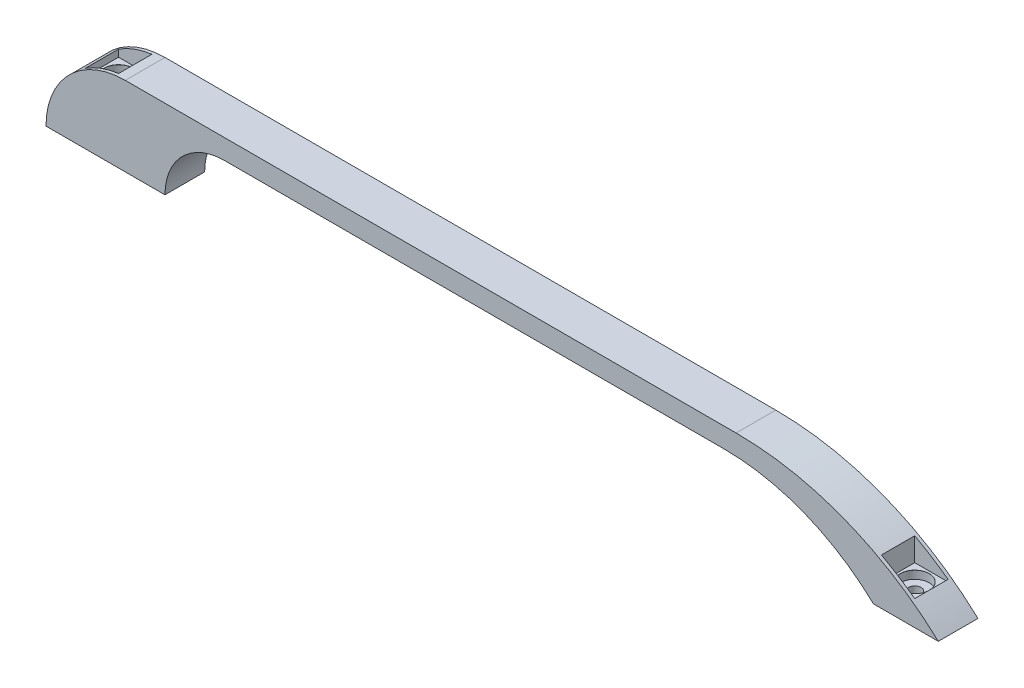
ISO-10303-21;
HEADER;
FILE_DESCRIPTION(('STEP AP214'),'2;1');
FILE_NAME('part.step','',(''),(''),'','','');
FILE_SCHEMA(('AUTOMOTIVE_DESIGN { 1 0 10303 214 1 1 1 1 }'));
ENDSEC;
DATA;
#1=APPLICATION_CONTEXT('core data for automotive mechanical design processes');
#2=APPLICATION_PROTOCOL_DEFINITION('international standard','automotive_design',2000,#1);
#3=PRODUCT_CONTEXT('',#1,'mechanical');
#4=PRODUCT('Part','Part','',(#3));
#5=PRODUCT_RELATED_PRODUCT_CATEGORY('part','',(#4));
#6=PRODUCT_DEFINITION_FORMATION('','',#4);
#7=PRODUCT_DEFINITION_CONTEXT('part definition',#1,'design');
#8=PRODUCT_DEFINITION('design','',#6,#7);
#9=PRODUCT_DEFINITION_SHAPE('','',#8);
#10=(LENGTH_UNIT() NAMED_UNIT(*) SI_UNIT(.MILLI.,.METRE.));
#11=(NAMED_UNIT(*) PLANE_ANGLE_UNIT() SI_UNIT($,.RADIAN.));
#12=(NAMED_UNIT(*) SI_UNIT($,.STERADIAN.) SOLID_ANGLE_UNIT());
#13=UNCERTAINTY_MEASURE_WITH_UNIT(LENGTH_MEASURE(1.E-05),#10,'distance_accuracy_value','');
#14=(GEOMETRIC_REPRESENTATION_CONTEXT(3) GLOBAL_UNCERTAINTY_ASSIGNED_CONTEXT((#13)) GLOBAL_UNIT_ASSIGNED_CONTEXT((#10,
#11,#12)) REPRESENTATION_CONTEXT('',''));
#15=CARTESIAN_POINT('',(0.,0.,0.));
#16=DIRECTION('',(0.,0.,1.));
#17=DIRECTION('',(1.,0.,0.));
#18=AXIS2_PLACEMENT_3D('',#15,#16,#17);
#19=CARTESIAN_POINT('',(348.019609728144,-110.,20.));
#20=DIRECTION('',(0.,0.,-1.));
#21=DIRECTION('',(-1.,0.,0.));
#22=AXIS2_PLACEMENT_3D('',#19,#20,#21);
#23=CYLINDRICAL_SURFACE('',#22,150.);
#24=CARTESIAN_POINT('',(348.019609728144,-110.,0.));
#25=DIRECTION('',(0.,0.,1.));
#26=DIRECTION('',(-1.,0.,0.));
#27=AXIS2_PLACEMENT_3D('',#24,#25,#26);
#28=CIRCLE('',#27,150.);
#29=CARTESIAN_POINT('',(450.,0.,0.));
#30=VERTEX_POINT('',#29);
#31=CARTESIAN_POINT('',(348.019609728144,40.,0.));
#32=VERTEX_POINT('',#31);
#33=EDGE_CURVE('E242',#30,#32,#28,.T.);
#34=ORIENTED_EDGE('',*,*,#33,.T.);
#35=DIRECTION('',(0.,0.,-1.));
#36=VECTOR('',#35,1.);
#37=CARTESIAN_POINT('',(348.019609728144,40.,20.));
#38=LINE('',#37,#36);
#39=CARTESIAN_POINT('',(348.019609728144,40.,20.));
#40=VERTEX_POINT('',#39);
#41=EDGE_CURVE('E247',#40,#32,#38,.T.);
#42=ORIENTED_EDGE('',*,*,#41,.F.);
#43=CARTESIAN_POINT('',(348.019609728144,-110.,20.));
#44=DIRECTION('',(0.,0.,1.));
#45=DIRECTION('',(-1.,0.,0.));
#46=AXIS2_PLACEMENT_3D('',#43,#44,#45);
#47=CIRCLE('',#46,150.);
#48=CARTESIAN_POINT('',(450.,0.,20.));
#49=VERTEX_POINT('',#48);
#50=EDGE_CURVE('E224',#49,#40,#47,.T.);
#51=ORIENTED_EDGE('',*,*,#50,.F.);
#52=DIRECTION('',(0.,0.,-1.));
#53=VECTOR('',#52,1.);
#54=CARTESIAN_POINT('',(450.,0.,20.));
#55=LINE('',#54,#53);
#56=EDGE_CURVE('E250',#49,#30,#55,.T.);
#57=ORIENTED_EDGE('',*,*,#56,.T.);
#58=EDGE_LOOP('',(#34,#42,#51,#57));
#59=FACE_BOUND('',#58,.T.);
#60=DIRECTION('',(0.,0.,-1.));
#61=VECTOR('',#60,1.);
#62=CARTESIAN_POINT('',(419.7,21.7646449184092,20.));
#63=LINE('',#62,#61);
#64=CARTESIAN_POINT('',(419.7,21.7646449184092,1.6));
#65=VERTEX_POINT('',#64);
#66=CARTESIAN_POINT('',(419.7,21.7646449184092,18.4));
#67=VERTEX_POINT('',#66);
#68=EDGE_CURVE('E11',#65,#67,#63,.F.);
#69=ORIENTED_EDGE('',*,*,#68,.F.);
#70=CARTESIAN_POINT('',(348.019609728144,-110.,1.60000000000001));
#71=DIRECTION('',(0.,0.,1.));
#72=DIRECTION('',(1.,0.,0.));
#73=AXIS2_PLACEMENT_3D('',#70,#71,#72);
#74=CIRCLE('',#73,150.);
#75=CARTESIAN_POINT('',(436.5,11.1248138794859,1.6));
#76=VERTEX_POINT('',#75);
#77=EDGE_CURVE('E276',#76,#65,#74,.T.);
#78=ORIENTED_EDGE('',*,*,#77,.F.);
#79=DIRECTION('',(0.,0.,-1.));
#80=VECTOR('',#79,1.);
#81=CARTESIAN_POINT('',(436.5,11.1248138794859,20.));
#82=LINE('',#81,#80);
#83=CARTESIAN_POINT('',(436.5,11.1248138794859,18.4));
#84=VERTEX_POINT('',#83);
#85=EDGE_CURVE('E278',#84,#76,#82,.T.);
#86=ORIENTED_EDGE('',*,*,#85,.F.);
#87=CARTESIAN_POINT('',(348.019609728144,-110.,18.4));
#88=DIRECTION('',(0.,0.,-1.));
#89=DIRECTION('',(-1.,0.,0.));
#90=AXIS2_PLACEMENT_3D('',#87,#88,#89);
#91=CIRCLE('',#90,150.);
#92=EDGE_CURVE('E49',#67,#84,#91,.T.);
#93=ORIENTED_EDGE('',*,*,#92,.F.);
#94=EDGE_LOOP('',(#69,#78,#86,#93));
#95=FACE_BOUND('',#94,.T.);
#96=ADVANCED_FACE('F40',(#59,#95),#23,.T.);
#97=CARTESIAN_POINT('',(40.,0.,20.));
#98=DIRECTION('',(0.,0.,-1.));
#99=DIRECTION('',(-1.,0.,0.));
#100=AXIS2_PLACEMENT_3D('',#97,#98,#99);
#101=CYLINDRICAL_SURFACE('',#100,40.);
#102=CARTESIAN_POINT('',(40.,0.,0.));
#103=DIRECTION('',(0.,0.,1.));
#104=DIRECTION('',(1.,0.,0.));
#105=AXIS2_PLACEMENT_3D('',#102,#103,#104);
#106=CIRCLE('',#105,40.);
#107=CARTESIAN_POINT('',(40.,40.,0.));
#108=VERTEX_POINT('',#107);
#109=CARTESIAN_POINT('',(0.,0.,0.));
#110=VERTEX_POINT('',#109);
#111=EDGE_CURVE('E209',#108,#110,#106,.T.);
#112=ORIENTED_EDGE('',*,*,#111,.T.);
#113=DIRECTION('',(0.,0.,-1.));
#114=VECTOR('',#113,1.);
#115=CARTESIAN_POINT('',(0.,0.,20.));
#116=LINE('',#115,#114);
#117=CARTESIAN_POINT('',(0.,0.,20.));
#118=VERTEX_POINT('',#117);
#119=EDGE_CURVE('E265',#118,#110,#116,.T.);
#120=ORIENTED_EDGE('',*,*,#119,.F.);
#121=CARTESIAN_POINT('',(40.,0.,20.));
#122=DIRECTION('',(0.,0.,1.));
#123=DIRECTION('',(1.,0.,0.));
#124=AXIS2_PLACEMENT_3D('',#121,#122,#123);
#125=CIRCLE('',#124,40.);
#126=CARTESIAN_POINT('',(40.,40.,20.));
#127=VERTEX_POINT('',#126);
#128=EDGE_CURVE('E210',#127,#118,#125,.T.);
#129=ORIENTED_EDGE('',*,*,#128,.F.);
#130=DIRECTION('',(0.,0.,-1.));
#131=VECTOR('',#130,1.);
#132=CARTESIAN_POINT('',(40.,40.,20.));
#133=LINE('',#132,#131);
#134=EDGE_CURVE('E228',#127,#108,#133,.T.);
#135=ORIENTED_EDGE('',*,*,#134,.T.);
#136=EDGE_LOOP('',(#112,#120,#129,#135));
#137=FACE_BOUND('',#136,.T.);
#138=CARTESIAN_POINT('',(40.,0.,1.6));
#139=DIRECTION('',(0.,0.,1.));
#140=DIRECTION('',(1.,0.,0.));
#141=AXIS2_PLACEMENT_3D('',#138,#139,#140);
#142=CIRCLE('',#141,40.);
#143=CARTESIAN_POINT('',(35.,39.6862696659689,1.6));
#144=VERTEX_POINT('',#143);
#145=CARTESIAN_POINT('',(18.2,33.5374417629014,1.6));
#146=VERTEX_POINT('',#145);
#147=EDGE_CURVE('E274',#144,#146,#142,.T.);
#148=ORIENTED_EDGE('',*,*,#147,.F.);
#149=DIRECTION('',(0.,0.,-1.));
#150=VECTOR('',#149,1.);
#151=CARTESIAN_POINT('',(35.,39.6862696659689,20.));
#152=LINE('',#151,#150);
#153=CARTESIAN_POINT('',(35.,39.6862696659689,18.4));
#154=VERTEX_POINT('',#153);
#155=EDGE_CURVE('E268',#154,#144,#152,.T.);
#156=ORIENTED_EDGE('',*,*,#155,.F.);
#157=CARTESIAN_POINT('',(40.,0.,18.4));
#158=DIRECTION('',(0.,0.,-1.));
#159=DIRECTION('',(-1.,0.,0.));
#160=AXIS2_PLACEMENT_3D('',#157,#158,#159);
#161=CIRCLE('',#160,40.);
#162=CARTESIAN_POINT('',(18.2,33.5374417629014,18.4));
#163=VERTEX_POINT('',#162);
#164=EDGE_CURVE('E270',#163,#154,#161,.T.);
#165=ORIENTED_EDGE('',*,*,#164,.F.);
#166=DIRECTION('',(0.,0.,-1.));
#167=VECTOR('',#166,1.);
#168=CARTESIAN_POINT('',(18.2,33.5374417629014,20.));
#169=LINE('',#168,#167);
#170=EDGE_CURVE('E272',#146,#163,#169,.F.);
#171=ORIENTED_EDGE('',*,*,#170,.F.);
#172=EDGE_LOOP('',(#148,#156,#165,#171));
#173=FACE_BOUND('',#172,.T.);
#174=ADVANCED_FACE('F42',(#137,#173),#101,.T.);
#175=CARTESIAN_POINT('',(0.,0.,20.));
#176=DIRECTION('',(0.,1.,0.));
#177=DIRECTION('',(0.,0.,1.));
#178=AXIS2_PLACEMENT_3D('',#175,#176,#177);
#179=PLANE('',#178);
#180=CARTESIAN_POINT('',(26.6,0.,10.));
#181=DIRECTION('',(0.,1.,0.));
#182=DIRECTION('',(0.,0.,1.));
#183=AXIS2_PLACEMENT_3D('',#180,#181,#182);
#184=CIRCLE('',#183,3.19999999999999);
#185=CARTESIAN_POINT('',(26.6,0.,13.2));
#186=VERTEX_POINT('',#185);
#187=EDGE_CURVE('E44',#186,#186,#184,.T.);
#188=ORIENTED_EDGE('',*,*,#187,.T.);
#189=EDGE_LOOP('',(#188));
#190=FACE_BOUND('',#189,.T.);
#191=DIRECTION('',(1.,0.,0.));
#192=VECTOR('',#191,1.);
#193=CARTESIAN_POINT('',(0.,0.,0.));
#194=LINE('',#193,#192);
#195=CARTESIAN_POINT('',(60.,0.,0.));
#196=VERTEX_POINT('',#195);
#197=EDGE_CURVE('E231',#110,#196,#194,.T.);
#198=ORIENTED_EDGE('',*,*,#197,.T.);
#199=DIRECTION('',(0.,0.,-1.));
#200=VECTOR('',#199,1.);
#201=CARTESIAN_POINT('',(60.,0.,20.));
#202=LINE('',#201,#200);
#203=CARTESIAN_POINT('',(60.,0.,20.));
#204=VERTEX_POINT('',#203);
#205=EDGE_CURVE('E262',#204,#196,#202,.T.);
#206=ORIENTED_EDGE('',*,*,#205,.F.);
#207=DIRECTION('',(1.,0.,0.));
#208=VECTOR('',#207,1.);
#209=CARTESIAN_POINT('',(0.,0.,20.));
#210=LINE('',#209,#208);
#211=EDGE_CURVE('E213',#118,#204,#210,.T.);
#212=ORIENTED_EDGE('',*,*,#211,.F.);
#213=ORIENTED_EDGE('',*,*,#119,.T.);
#214=EDGE_LOOP('',(#198,#206,#212,#213));
#215=FACE_BOUND('',#214,.T.);
#216=ADVANCED_FACE('F302',(#190,#215),#179,.F.);
#217=CARTESIAN_POINT('',(90.,0.,20.));
#218=DIRECTION('',(0.,0.,-1.));
#219=DIRECTION('',(-1.,0.,0.));
#220=AXIS2_PLACEMENT_3D('',#217,#218,#219);
#221=CYLINDRICAL_SURFACE('',#220,30.);
#222=CARTESIAN_POINT('',(90.,0.,0.));
#223=DIRECTION('',(0.,0.,-1.));
#224=DIRECTION('',(-1.,0.,0.));
#225=AXIS2_PLACEMENT_3D('',#222,#223,#224);
#226=CIRCLE('',#225,30.);
#227=CARTESIAN_POINT('',(90.,30.,0.));
#228=VERTEX_POINT('',#227);
#229=EDGE_CURVE('E233',#196,#228,#226,.T.);
#230=ORIENTED_EDGE('',*,*,#229,.T.);
#231=DIRECTION('',(0.,0.,-1.));
#232=VECTOR('',#231,1.);
#233=CARTESIAN_POINT('',(90.,30.,20.));
#234=LINE('',#233,#232);
#235=CARTESIAN_POINT('',(90.,30.,20.));
#236=VERTEX_POINT('',#235);
#237=EDGE_CURVE('E259',#236,#228,#234,.T.);
#238=ORIENTED_EDGE('',*,*,#237,.F.);
#239=CARTESIAN_POINT('',(90.,0.,20.));
#240=DIRECTION('',(0.,0.,-1.));
#241=DIRECTION('',(-1.,0.,0.));
#242=AXIS2_PLACEMENT_3D('',#239,#240,#241);
#243=CIRCLE('',#242,30.);
#244=EDGE_CURVE('E216',#204,#236,#243,.T.);
#245=ORIENTED_EDGE('',*,*,#244,.F.);
#246=ORIENTED_EDGE('',*,*,#205,.T.);
#247=EDGE_LOOP('',(#230,#238,#245,#246));
#248=FACE_BOUND('',#247,.T.);
#249=ADVANCED_FACE('F319',(#248),#221,.F.);
#250=CARTESIAN_POINT('',(342.,30.,20.));
#251=DIRECTION('',(0.,1.,0.));
#252=DIRECTION('',(-1.,0.,0.));
#253=AXIS2_PLACEMENT_3D('',#250,#251,#252);
#254=PLANE('',#253);
#255=DIRECTION('',(1.,0.,0.));
#256=VECTOR('',#255,1.);
#257=CARTESIAN_POINT('',(342.,30.,0.));
#258=LINE('',#257,#256);
#259=CARTESIAN_POINT('',(342.,30.,0.));
#260=VERTEX_POINT('',#259);
#261=EDGE_CURVE('E236',#228,#260,#258,.T.);
#262=ORIENTED_EDGE('',*,*,#261,.T.);
#263=DIRECTION('',(0.,0.,-1.));
#264=VECTOR('',#263,1.);
#265=CARTESIAN_POINT('',(342.,30.,20.));
#266=LINE('',#265,#264);
#267=CARTESIAN_POINT('',(342.,30.,20.));
#268=VERTEX_POINT('',#267);
#269=EDGE_CURVE('E256',#268,#260,#266,.T.);
#270=ORIENTED_EDGE('',*,*,#269,.F.);
#271=DIRECTION('',(1.,0.,0.));
#272=VECTOR('',#271,1.);
#273=CARTESIAN_POINT('',(90.,30.,20.));
#274=LINE('',#273,#272);
#275=EDGE_CURVE('E218',#236,#268,#274,.T.);
#276=ORIENTED_EDGE('',*,*,#275,.F.);
#277=ORIENTED_EDGE('',*,*,#237,.T.);
#278=EDGE_LOOP('',(#262,#270,#276,#277));
#279=FACE_BOUND('',#278,.T.);
#280=ADVANCED_FACE('F315',(#279),#254,.F.);
#281=CARTESIAN_POINT('',(341.782107923545,-79.9997841954384,20.));
#282=DIRECTION('',(0.,0.,-1.));
#283=DIRECTION('',(-1.,0.,0.));
#284=AXIS2_PLACEMENT_3D('',#281,#282,#283);
#285=CYLINDRICAL_SURFACE('',#284,110.);
#286=CARTESIAN_POINT('',(341.782107923545,-79.9997841954384,0.));
#287=DIRECTION('',(0.,0.,-1.));
#288=DIRECTION('',(-1.,0.,0.));
#289=AXIS2_PLACEMENT_3D('',#286,#287,#288);
#290=CIRCLE('',#289,110.);
#291=CARTESIAN_POINT('',(417.280680947698,0.,0.));
#292=VERTEX_POINT('',#291);
#293=EDGE_CURVE('E238',#260,#292,#290,.T.);
#294=ORIENTED_EDGE('',*,*,#293,.T.);
#295=DIRECTION('',(0.,0.,-1.));
#296=VECTOR('',#295,1.);
#297=CARTESIAN_POINT('',(417.280680947698,0.,20.));
#298=LINE('',#297,#296);
#299=CARTESIAN_POINT('',(417.280680947698,0.,20.));
#300=VERTEX_POINT('',#299);
#301=EDGE_CURVE('E253',#300,#292,#298,.T.);
#302=ORIENTED_EDGE('',*,*,#301,.F.);
#303=CARTESIAN_POINT('',(341.782107923545,-79.9997841954384,20.));
#304=DIRECTION('',(0.,0.,-1.));
#305=DIRECTION('',(-1.,0.,0.));
#306=AXIS2_PLACEMENT_3D('',#303,#304,#305);
#307=CIRCLE('',#306,110.);
#308=EDGE_CURVE('E220',#268,#300,#307,.T.);
#309=ORIENTED_EDGE('',*,*,#308,.F.);
#310=ORIENTED_EDGE('',*,*,#269,.T.);
#311=EDGE_LOOP('',(#294,#302,#309,#310));
#312=FACE_BOUND('',#311,.T.);
#313=ADVANCED_FACE('F311',(#312),#285,.F.);
#314=CARTESIAN_POINT('',(450.,0.,20.));
#315=DIRECTION('',(0.,1.,0.));
#316=DIRECTION('',(-1.,0.,0.));
#317=AXIS2_PLACEMENT_3D('',#314,#315,#316);
#318=PLANE('',#317);
#319=CARTESIAN_POINT('',(428.1,0.,10.));
#320=DIRECTION('',(0.,1.,0.));
#321=DIRECTION('',(-1.,0.,0.));
#322=AXIS2_PLACEMENT_3D('',#319,#320,#321);
#323=CIRCLE('',#322,3.19999999999998);
#324=CARTESIAN_POINT('',(424.9,0.,10.));
#325=VERTEX_POINT('',#324);
#326=EDGE_CURVE('E178',#325,#325,#323,.T.);
#327=ORIENTED_EDGE('',*,*,#326,.T.);
#328=EDGE_LOOP('',(#327));
#329=FACE_BOUND('',#328,.T.);
#330=DIRECTION('',(1.,0.,0.));
#331=VECTOR('',#330,1.);
#332=CARTESIAN_POINT('',(450.,0.,0.));
#333=LINE('',#332,#331);
#334=EDGE_CURVE('E240',#292,#30,#333,.T.);
#335=ORIENTED_EDGE('',*,*,#334,.T.);
#336=ORIENTED_EDGE('',*,*,#56,.F.);
#337=DIRECTION('',(1.,0.,0.));
#338=VECTOR('',#337,1.);
#339=CARTESIAN_POINT('',(450.,0.,20.));
#340=LINE('',#339,#338);
#341=EDGE_CURVE('E222',#300,#49,#340,.T.);
#342=ORIENTED_EDGE('',*,*,#341,.F.);
#343=ORIENTED_EDGE('',*,*,#301,.T.);
#344=EDGE_LOOP('',(#335,#336,#342,#343));
#345=FACE_BOUND('',#344,.T.);
#346=ADVANCED_FACE('F308',(#329,#345),#318,.F.);
#347=CARTESIAN_POINT('',(40.,40.,20.));
#348=DIRECTION('',(0.,-1.,0.));
#349=DIRECTION('',(1.,0.,0.));
#350=AXIS2_PLACEMENT_3D('',#347,#348,#349);
#351=PLANE('',#350);
#352=DIRECTION('',(-1.,0.,0.));
#353=VECTOR('',#352,1.);
#354=CARTESIAN_POINT('',(40.,40.,0.));
#355=LINE('',#354,#353);
#356=EDGE_CURVE('E214',#32,#108,#355,.T.);
#357=ORIENTED_EDGE('',*,*,#356,.T.);
#358=ORIENTED_EDGE('',*,*,#134,.F.);
#359=DIRECTION('',(-1.,0.,0.));
#360=VECTOR('',#359,1.);
#361=CARTESIAN_POINT('',(40.,40.,20.));
#362=LINE('',#361,#360);
#363=EDGE_CURVE('E226',#40,#127,#362,.T.);
#364=ORIENTED_EDGE('',*,*,#363,.F.);
#365=ORIENTED_EDGE('',*,*,#41,.T.);
#366=EDGE_LOOP('',(#357,#358,#364,#365));
#367=FACE_BOUND('',#366,.T.);
#368=ADVANCED_FACE('F306',(#367),#351,.F.);
#369=CARTESIAN_POINT('',(40.,0.,20.));
#370=DIRECTION('',(0.,0.,1.));
#371=DIRECTION('',(1.,0.,0.));
#372=AXIS2_PLACEMENT_3D('',#369,#370,#371);
#373=PLANE('',#372);
#374=ORIENTED_EDGE('',*,*,#128,.T.);
#375=ORIENTED_EDGE('',*,*,#211,.T.);
#376=ORIENTED_EDGE('',*,*,#244,.T.);
#377=ORIENTED_EDGE('',*,*,#275,.T.);
#378=ORIENTED_EDGE('',*,*,#308,.T.);
#379=ORIENTED_EDGE('',*,*,#341,.T.);
#380=ORIENTED_EDGE('',*,*,#50,.T.);
#381=ORIENTED_EDGE('',*,*,#363,.T.);
#382=EDGE_LOOP('',(#374,#375,#376,#377,#378,#379,#380,#381));
#383=FACE_BOUND('',#382,.T.);
#384=ADVANCED_FACE('F346',(#383),#373,.T.);
#385=CARTESIAN_POINT('',(40.,0.,0.));
#386=DIRECTION('',(0.,0.,1.));
#387=DIRECTION('',(1.,0.,0.));
#388=AXIS2_PLACEMENT_3D('',#385,#386,#387);
#389=PLANE('',#388);
#390=ORIENTED_EDGE('',*,*,#111,.F.);
#391=ORIENTED_EDGE('',*,*,#356,.F.);
#392=ORIENTED_EDGE('',*,*,#33,.F.);
#393=ORIENTED_EDGE('',*,*,#334,.F.);
#394=ORIENTED_EDGE('',*,*,#293,.F.);
#395=ORIENTED_EDGE('',*,*,#261,.F.);
#396=ORIENTED_EDGE('',*,*,#229,.F.);
#397=ORIENTED_EDGE('',*,*,#197,.F.);
#398=EDGE_LOOP('',(#390,#391,#392,#393,#394,#395,#396,#397));
#399=FACE_BOUND('',#398,.T.);
#400=ADVANCED_FACE('F337',(#399),#389,.F.);
#401=CARTESIAN_POINT('',(35.,50.,1.6));
#402=DIRECTION('',(0.,0.,1.));
#403=DIRECTION('',(1.,0.,0.));
#404=AXIS2_PLACEMENT_3D('',#401,#402,#403);
#405=PLANE('',#404);
#406=ORIENTED_EDGE('',*,*,#147,.T.);
#407=DIRECTION('',(0.,-1.,0.));
#408=VECTOR('',#407,1.);
#409=CARTESIAN_POINT('',(18.2,50.,1.6));
#410=LINE('',#409,#408);
#411=CARTESIAN_POINT('',(18.2,30.,1.6));
#412=VERTEX_POINT('',#411);
#413=EDGE_CURVE('E207',#146,#412,#410,.T.);
#414=ORIENTED_EDGE('',*,*,#413,.T.);
#415=DIRECTION('',(-1.,0.,0.));
#416=VECTOR('',#415,1.);
#417=CARTESIAN_POINT('',(35.,30.,1.6));
#418=LINE('',#417,#416);
#419=CARTESIAN_POINT('',(35.,30.,1.6));
#420=VERTEX_POINT('',#419);
#421=EDGE_CURVE('E163',#420,#412,#418,.T.);
#422=ORIENTED_EDGE('',*,*,#421,.F.);
#423=DIRECTION('',(0.,-1.,0.));
#424=VECTOR('',#423,1.);
#425=CARTESIAN_POINT('',(35.,50.,1.6));
#426=LINE('',#425,#424);
#427=EDGE_CURVE('E202',#144,#420,#426,.T.);
#428=ORIENTED_EDGE('',*,*,#427,.F.);
#429=EDGE_LOOP('',(#406,#414,#422,#428));
#430=FACE_BOUND('',#429,.T.);
#431=ADVANCED_FACE('F366',(#430),#405,.T.);
#432=CARTESIAN_POINT('',(18.2,50.,1.6));
#433=DIRECTION('',(1.,0.,0.));
#434=DIRECTION('',(0.,0.,-1.));
#435=AXIS2_PLACEMENT_3D('',#432,#433,#434);
#436=PLANE('',#435);
#437=ORIENTED_EDGE('',*,*,#170,.T.);
#438=DIRECTION('',(0.,-1.,0.));
#439=VECTOR('',#438,1.);
#440=CARTESIAN_POINT('',(18.2,50.,18.4));
#441=LINE('',#440,#439);
#442=CARTESIAN_POINT('',(18.2,30.,18.4));
#443=VERTEX_POINT('',#442);
#444=EDGE_CURVE('E205',#163,#443,#441,.T.);
#445=ORIENTED_EDGE('',*,*,#444,.T.);
#446=DIRECTION('',(0.,0.,1.));
#447=VECTOR('',#446,1.);
#448=CARTESIAN_POINT('',(18.2,30.,1.6));
#449=LINE('',#448,#447);
#450=EDGE_CURVE('E193',#412,#443,#449,.T.);
#451=ORIENTED_EDGE('',*,*,#450,.F.);
#452=ORIENTED_EDGE('',*,*,#413,.F.);
#453=EDGE_LOOP('',(#437,#445,#451,#452));
#454=FACE_BOUND('',#453,.T.);
#455=ADVANCED_FACE('F370',(#454),#436,.T.);
#456=CARTESIAN_POINT('',(18.2,50.,18.4));
#457=DIRECTION('',(0.,0.,-1.));
#458=DIRECTION('',(-1.,0.,0.));
#459=AXIS2_PLACEMENT_3D('',#456,#457,#458);
#460=PLANE('',#459);
#461=ORIENTED_EDGE('',*,*,#164,.T.);
#462=DIRECTION('',(0.,-1.,0.));
#463=VECTOR('',#462,1.);
#464=CARTESIAN_POINT('',(35.,50.,18.4));
#465=LINE('',#464,#463);
#466=CARTESIAN_POINT('',(35.,30.,18.4));
#467=VERTEX_POINT('',#466);
#468=EDGE_CURVE('E65',#154,#467,#465,.T.);
#469=ORIENTED_EDGE('',*,*,#468,.T.);
#470=DIRECTION('',(1.,0.,0.));
#471=VECTOR('',#470,1.);
#472=CARTESIAN_POINT('',(18.2,30.,18.4));
#473=LINE('',#472,#471);
#474=EDGE_CURVE('E196',#443,#467,#473,.T.);
#475=ORIENTED_EDGE('',*,*,#474,.F.);
#476=ORIENTED_EDGE('',*,*,#444,.F.);
#477=EDGE_LOOP('',(#461,#469,#475,#476));
#478=FACE_BOUND('',#477,.T.);
#479=ADVANCED_FACE('F374',(#478),#460,.T.);
#480=CARTESIAN_POINT('',(35.,50.,18.4));
#481=DIRECTION('',(-1.,0.,0.));
#482=DIRECTION('',(0.,0.,1.));
#483=AXIS2_PLACEMENT_3D('',#480,#481,#482);
#484=PLANE('',#483);
#485=ORIENTED_EDGE('',*,*,#155,.T.);
#486=ORIENTED_EDGE('',*,*,#427,.T.);
#487=DIRECTION('',(0.,0.,-1.));
#488=VECTOR('',#487,1.);
#489=CARTESIAN_POINT('',(35.,30.,18.4));
#490=LINE('',#489,#488);
#491=EDGE_CURVE('E199',#467,#420,#490,.T.);
#492=ORIENTED_EDGE('',*,*,#491,.F.);
#493=ORIENTED_EDGE('',*,*,#468,.F.);
#494=EDGE_LOOP('',(#485,#486,#492,#493));
#495=FACE_BOUND('',#494,.T.);
#496=ADVANCED_FACE('F378',(#495),#484,.T.);
#497=CARTESIAN_POINT('',(0.,30.,0.));
#498=DIRECTION('',(0.,1.,0.));
#499=DIRECTION('',(0.,0.,1.));
#500=AXIS2_PLACEMENT_3D('',#497,#498,#499);
#501=PLANE('',#500);
#502=CARTESIAN_POINT('',(26.6,30.,10.));
#503=DIRECTION('',(0.,1.,0.));
#504=DIRECTION('',(0.,0.,1.));
#505=AXIS2_PLACEMENT_3D('',#502,#503,#504);
#506=CIRCLE('',#505,7.2985);
#507=CARTESIAN_POINT('',(26.6,30.,17.2985));
#508=VERTEX_POINT('',#507);
#509=EDGE_CURVE('E643',#508,#508,#506,.T.);
#510=ORIENTED_EDGE('',*,*,#509,.F.);
#511=EDGE_LOOP('',(#510));
#512=FACE_BOUND('',#511,.T.);
#513=ORIENTED_EDGE('',*,*,#421,.T.);
#514=ORIENTED_EDGE('',*,*,#450,.T.);
#515=ORIENTED_EDGE('',*,*,#474,.T.);
#516=ORIENTED_EDGE('',*,*,#491,.T.);
#517=EDGE_LOOP('',(#513,#514,#515,#516));
#518=FACE_BOUND('',#517,.T.);
#519=ADVANCED_FACE('F382',(#512,#518),#501,.T.);
#520=CARTESIAN_POINT('',(419.7,30.,1.6));
#521=DIRECTION('',(1.,0.,0.));
#522=DIRECTION('',(0.,0.,-1.));
#523=AXIS2_PLACEMENT_3D('',#520,#521,#522);
#524=PLANE('',#523);
#525=ORIENTED_EDGE('',*,*,#68,.T.);
#526=DIRECTION('',(0.,-1.,0.));
#527=VECTOR('',#526,1.);
#528=CARTESIAN_POINT('',(419.7,30.,18.4));
#529=LINE('',#528,#527);
#530=CARTESIAN_POINT('',(419.7,10.,18.4));
#531=VERTEX_POINT('',#530);
#532=EDGE_CURVE('E154',#67,#531,#529,.T.);
#533=ORIENTED_EDGE('',*,*,#532,.T.);
#534=DIRECTION('',(0.,0.,1.));
#535=VECTOR('',#534,1.);
#536=CARTESIAN_POINT('',(419.7,10.,1.6));
#537=LINE('',#536,#535);
#538=CARTESIAN_POINT('',(419.7,10.,1.6));
#539=VERTEX_POINT('',#538);
#540=EDGE_CURVE('E159',#539,#531,#537,.T.);
#541=ORIENTED_EDGE('',*,*,#540,.F.);
#542=DIRECTION('',(0.,-1.,0.));
#543=VECTOR('',#542,1.);
#544=CARTESIAN_POINT('',(419.7,30.,1.6));
#545=LINE('',#544,#543);
#546=EDGE_CURVE('E187',#65,#539,#545,.T.);
#547=ORIENTED_EDGE('',*,*,#546,.F.);
#548=EDGE_LOOP('',(#525,#533,#541,#547));
#549=FACE_BOUND('',#548,.T.);
#550=ADVANCED_FACE('F156',(#549),#524,.T.);
#551=CARTESIAN_POINT('',(419.7,30.,18.4));
#552=DIRECTION('',(0.,0.,-1.));
#553=DIRECTION('',(-1.,0.,0.));
#554=AXIS2_PLACEMENT_3D('',#551,#552,#553);
#555=PLANE('',#554);
#556=ORIENTED_EDGE('',*,*,#92,.T.);
#557=DIRECTION('',(0.,-1.,0.));
#558=VECTOR('',#557,1.);
#559=CARTESIAN_POINT('',(436.5,30.,18.4));
#560=LINE('',#559,#558);
#561=CARTESIAN_POINT('',(436.5,10.,18.4));
#562=VERTEX_POINT('',#561);
#563=EDGE_CURVE('E164',#84,#562,#560,.T.);
#564=ORIENTED_EDGE('',*,*,#563,.T.);
#565=DIRECTION('',(1.,0.,0.));
#566=VECTOR('',#565,1.);
#567=CARTESIAN_POINT('',(419.7,10.,18.4));
#568=LINE('',#567,#566);
#569=EDGE_CURVE('E167',#531,#562,#568,.T.);
#570=ORIENTED_EDGE('',*,*,#569,.F.);
#571=ORIENTED_EDGE('',*,*,#532,.F.);
#572=EDGE_LOOP('',(#556,#564,#570,#571));
#573=FACE_BOUND('',#572,.T.);
#574=ADVANCED_FACE('F168',(#573),#555,.T.);
#575=CARTESIAN_POINT('',(436.5,30.,18.4));
#576=DIRECTION('',(-1.,0.,0.));
#577=DIRECTION('',(0.,0.,1.));
#578=AXIS2_PLACEMENT_3D('',#575,#576,#577);
#579=PLANE('',#578);
#580=ORIENTED_EDGE('',*,*,#85,.T.);
#581=DIRECTION('',(0.,-1.,0.));
#582=VECTOR('',#581,1.);
#583=CARTESIAN_POINT('',(436.5,30.,1.6));
#584=LINE('',#583,#582);
#585=CARTESIAN_POINT('',(436.5,10.,1.6));
#586=VERTEX_POINT('',#585);
#587=EDGE_CURVE('E57',#76,#586,#584,.T.);
#588=ORIENTED_EDGE('',*,*,#587,.T.);
#589=DIRECTION('',(0.,0.,-1.));
#590=VECTOR('',#589,1.);
#591=CARTESIAN_POINT('',(436.5,10.,18.4));
#592=LINE('',#591,#590);
#593=EDGE_CURVE('E173',#562,#586,#592,.T.);
#594=ORIENTED_EDGE('',*,*,#593,.F.);
#595=ORIENTED_EDGE('',*,*,#563,.F.);
#596=EDGE_LOOP('',(#580,#588,#594,#595));
#597=FACE_BOUND('',#596,.T.);
#598=ADVANCED_FACE('F283',(#597),#579,.T.);
#599=CARTESIAN_POINT('',(436.5,30.,1.6));
#600=DIRECTION('',(0.,0.,1.));
#601=DIRECTION('',(1.,0.,0.));
#602=AXIS2_PLACEMENT_3D('',#599,#600,#601);
#603=PLANE('',#602);
#604=ORIENTED_EDGE('',*,*,#77,.T.);
#605=ORIENTED_EDGE('',*,*,#546,.T.);
#606=DIRECTION('',(-1.,0.,0.));
#607=VECTOR('',#606,1.);
#608=CARTESIAN_POINT('',(436.5,10.,1.6));
#609=LINE('',#608,#607);
#610=EDGE_CURVE('E177',#586,#539,#609,.T.);
#611=ORIENTED_EDGE('',*,*,#610,.F.);
#612=ORIENTED_EDGE('',*,*,#587,.F.);
#613=EDGE_LOOP('',(#604,#605,#611,#612));
#614=FACE_BOUND('',#613,.T.);
#615=ADVANCED_FACE('F285',(#614),#603,.T.);
#616=CARTESIAN_POINT('',(0.,10.,0.));
#617=DIRECTION('',(0.,1.,0.));
#618=DIRECTION('',(0.,0.,1.));
#619=AXIS2_PLACEMENT_3D('',#616,#617,#618);
#620=PLANE('',#619);
#621=CARTESIAN_POINT('',(428.1,10.,10.));
#622=DIRECTION('',(0.,1.,0.));
#623=DIRECTION('',(0.,0.,1.));
#624=AXIS2_PLACEMENT_3D('',#621,#622,#623);
#625=CIRCLE('',#624,7.29849999999999);
#626=CARTESIAN_POINT('',(428.1,10.,17.2985));
#627=VERTEX_POINT('',#626);
#628=EDGE_CURVE('E653',#627,#627,#625,.T.);
#629=ORIENTED_EDGE('',*,*,#628,.F.);
#630=EDGE_LOOP('',(#629));
#631=FACE_BOUND('',#630,.T.);
#632=ORIENTED_EDGE('',*,*,#540,.T.);
#633=ORIENTED_EDGE('',*,*,#569,.T.);
#634=ORIENTED_EDGE('',*,*,#593,.T.);
#635=ORIENTED_EDGE('',*,*,#610,.T.);
#636=EDGE_LOOP('',(#632,#633,#634,#635));
#637=FACE_BOUND('',#636,.T.);
#638=ADVANCED_FACE('F176',(#631,#637),#620,.T.);
#639=CARTESIAN_POINT('',(428.1,10.,10.));
#640=DIRECTION('',(0.,1.,0.));
#641=DIRECTION('',(0.,0.,1.));
#642=AXIS2_PLACEMENT_3D('',#639,#640,#641);
#643=CYLINDRICAL_SURFACE('',#642,3.19999999999998);
#644=CARTESIAN_POINT('',(428.1,6.,10.));
#645=DIRECTION('',(0.,1.,0.));
#646=DIRECTION('',(0.,0.,1.));
#647=AXIS2_PLACEMENT_3D('',#644,#645,#646);
#648=CIRCLE('',#647,3.19999999999998);
#649=CARTESIAN_POINT('',(428.1,6.,13.2));
#650=VERTEX_POINT('',#649);
#651=EDGE_CURVE('E181',#650,#650,#648,.T.);
#652=ORIENTED_EDGE('',*,*,#651,.T.);
#653=EDGE_LOOP('',(#652));
#654=FACE_BOUND('',#653,.T.);
#655=ORIENTED_EDGE('',*,*,#326,.F.);
#656=EDGE_LOOP('',(#655));
#657=FACE_BOUND('',#656,.T.);
#658=ADVANCED_FACE('F292',(#654,#657),#643,.F.);
#659=CARTESIAN_POINT('',(431.3,6.,10.));
#660=DIRECTION('',(0.,-1.,0.));
#661=DIRECTION('',(0.,0.,-1.));
#662=AXIS2_PLACEMENT_3D('',#659,#660,#661);
#663=PLANE('',#662);
#664=ORIENTED_EDGE('',*,*,#651,.F.);
#665=EDGE_LOOP('',(#664));
#666=FACE_BOUND('',#665,.T.);
#667=CARTESIAN_POINT('',(428.1,6.,10.));
#668=DIRECTION('',(0.,1.,0.));
#669=DIRECTION('',(0.,0.,1.));
#670=AXIS2_PLACEMENT_3D('',#667,#668,#669);
#671=CIRCLE('',#670,7.27349999999999);
#672=CARTESIAN_POINT('',(428.1,6.,17.2735));
#673=VERTEX_POINT('',#672);
#674=EDGE_CURVE('E658',#673,#673,#671,.T.);
#675=ORIENTED_EDGE('',*,*,#674,.T.);
#676=EDGE_LOOP('',(#675));
#677=FACE_BOUND('',#676,.T.);
#678=ADVANCED_FACE('F428',(#666,#677),#663,.F.);
#679=CARTESIAN_POINT('',(428.1,10.,10.));
#680=DIRECTION('',(0.,1.,0.));
#681=DIRECTION('',(0.,0.,1.));
#682=AXIS2_PLACEMENT_3D('',#679,#680,#681);
#683=CYLINDRICAL_SURFACE('',#682,7.27349999999999);
#684=ORIENTED_EDGE('',*,*,#674,.F.);
#685=EDGE_LOOP('',(#684));
#686=FACE_BOUND('',#685,.T.);
#687=CARTESIAN_POINT('',(428.1,9.975,10.));
#688=DIRECTION('',(0.,1.,0.));
#689=DIRECTION('',(0.,0.,1.));
#690=AXIS2_PLACEMENT_3D('',#687,#688,#689);
#691=CIRCLE('',#690,7.27349999999999);
#692=CARTESIAN_POINT('',(428.1,9.975,17.2735));
#693=VERTEX_POINT('',#692);
#694=EDGE_CURVE('E656',#693,#693,#691,.T.);
#695=ORIENTED_EDGE('',*,*,#694,.T.);
#696=EDGE_LOOP('',(#695));
#697=FACE_BOUND('',#696,.T.);
#698=ADVANCED_FACE('F439',(#686,#697),#683,.F.);
#699=CARTESIAN_POINT('',(428.1,10.,10.));
#700=DIRECTION('',(0.,1.,0.));
#701=DIRECTION('',(0.,0.,1.));
#702=AXIS2_PLACEMENT_3D('',#699,#700,#701);
#703=CONICAL_SURFACE('',#702,7.29849999999999,0.78539816339731);
#704=ORIENTED_EDGE('',*,*,#694,.F.);
#705=EDGE_LOOP('',(#704));
#706=FACE_BOUND('',#705,.T.);
#707=ORIENTED_EDGE('',*,*,#628,.T.);
#708=EDGE_LOOP('',(#707));
#709=FACE_BOUND('',#708,.T.);
#710=ADVANCED_FACE('F450',(#706,#709),#703,.F.);
#711=CARTESIAN_POINT('',(26.6,30.,10.));
#712=DIRECTION('',(0.,1.,0.));
#713=DIRECTION('',(0.,0.,1.));
#714=AXIS2_PLACEMENT_3D('',#711,#712,#713);
#715=CYLINDRICAL_SURFACE('',#714,3.19999999999999);
#716=CARTESIAN_POINT('',(26.6,26.,10.));
#717=DIRECTION('',(0.,1.,0.));
#718=DIRECTION('',(0.,0.,1.));
#719=AXIS2_PLACEMENT_3D('',#716,#717,#718);
#720=CIRCLE('',#719,3.19999999999999);
#721=CARTESIAN_POINT('',(26.6,26.,13.2));
#722=VERTEX_POINT('',#721);
#723=EDGE_CURVE('E650',#722,#722,#720,.T.);
#724=ORIENTED_EDGE('',*,*,#723,.T.);
#725=EDGE_LOOP('',(#724));
#726=FACE_BOUND('',#725,.T.);
#727=ORIENTED_EDGE('',*,*,#187,.F.);
#728=EDGE_LOOP('',(#727));
#729=FACE_BOUND('',#728,.T.);
#730=ADVANCED_FACE('F460',(#726,#729),#715,.F.);
#731=CARTESIAN_POINT('',(29.8,26.,10.));
#732=DIRECTION('',(0.,-1.,0.));
#733=DIRECTION('',(0.,0.,-1.));
#734=AXIS2_PLACEMENT_3D('',#731,#732,#733);
#735=PLANE('',#734);
#736=ORIENTED_EDGE('',*,*,#723,.F.);
#737=EDGE_LOOP('',(#736));
#738=FACE_BOUND('',#737,.T.);
#739=CARTESIAN_POINT('',(26.6,26.,10.));
#740=DIRECTION('',(0.,1.,0.));
#741=DIRECTION('',(0.,0.,1.));
#742=AXIS2_PLACEMENT_3D('',#739,#740,#741);
#743=CIRCLE('',#742,7.2735);
#744=CARTESIAN_POINT('',(26.6,26.,17.2735));
#745=VERTEX_POINT('',#744);
#746=EDGE_CURVE('E645',#745,#745,#743,.T.);
#747=ORIENTED_EDGE('',*,*,#746,.T.);
#748=EDGE_LOOP('',(#747));
#749=FACE_BOUND('',#748,.T.);
#750=ADVANCED_FACE('F487',(#738,#749),#735,.F.);
#751=CARTESIAN_POINT('',(26.6,30.,10.));
#752=DIRECTION('',(0.,1.,0.));
#753=DIRECTION('',(0.,0.,1.));
#754=AXIS2_PLACEMENT_3D('',#751,#752,#753);
#755=CYLINDRICAL_SURFACE('',#754,7.2735);
#756=ORIENTED_EDGE('',*,*,#746,.F.);
#757=EDGE_LOOP('',(#756));
#758=FACE_BOUND('',#757,.T.);
#759=CARTESIAN_POINT('',(26.6,29.975,10.));
#760=DIRECTION('',(0.,1.,0.));
#761=DIRECTION('',(0.,0.,1.));
#762=AXIS2_PLACEMENT_3D('',#759,#760,#761);
#763=CIRCLE('',#762,7.2735);
#764=CARTESIAN_POINT('',(26.6,29.975,17.2735));
#765=VERTEX_POINT('',#764);
#766=EDGE_CURVE('E640',#765,#765,#763,.T.);
#767=ORIENTED_EDGE('',*,*,#766,.T.);
#768=EDGE_LOOP('',(#767));
#769=FACE_BOUND('',#768,.T.);
#770=ADVANCED_FACE('F498',(#758,#769),#755,.F.);
#771=CARTESIAN_POINT('',(26.6,30.,10.));
#772=DIRECTION('',(0.,1.,0.));
#773=DIRECTION('',(0.,0.,1.));
#774=AXIS2_PLACEMENT_3D('',#771,#772,#773);
#775=CONICAL_SURFACE('',#774,7.2985,0.785398163397448);
#776=ORIENTED_EDGE('',*,*,#766,.F.);
#777=EDGE_LOOP('',(#776));
#778=FACE_BOUND('',#777,.T.);
#779=ORIENTED_EDGE('',*,*,#509,.T.);
#780=EDGE_LOOP('',(#779));
#781=FACE_BOUND('',#780,.T.);
#782=ADVANCED_FACE('F509',(#778,#781),#775,.F.);
#783=CLOSED_SHELL('',(#96,#174,#216,#249,#280,#313,#346,#368,#384,#400,#431,#455,#479,#496,#519,
#550,#574,#598,#615,#638,#658,#678,#698,#710,#730,#750,#770,#782));
#784=MANIFOLD_SOLID_BREP('B2',#783);
#785=ADVANCED_BREP_SHAPE_REPRESENTATION('',(#18,#784),#14);
#786=SHAPE_DEFINITION_REPRESENTATION(#9,#785);
ENDSEC;
END-ISO-10303-21;
